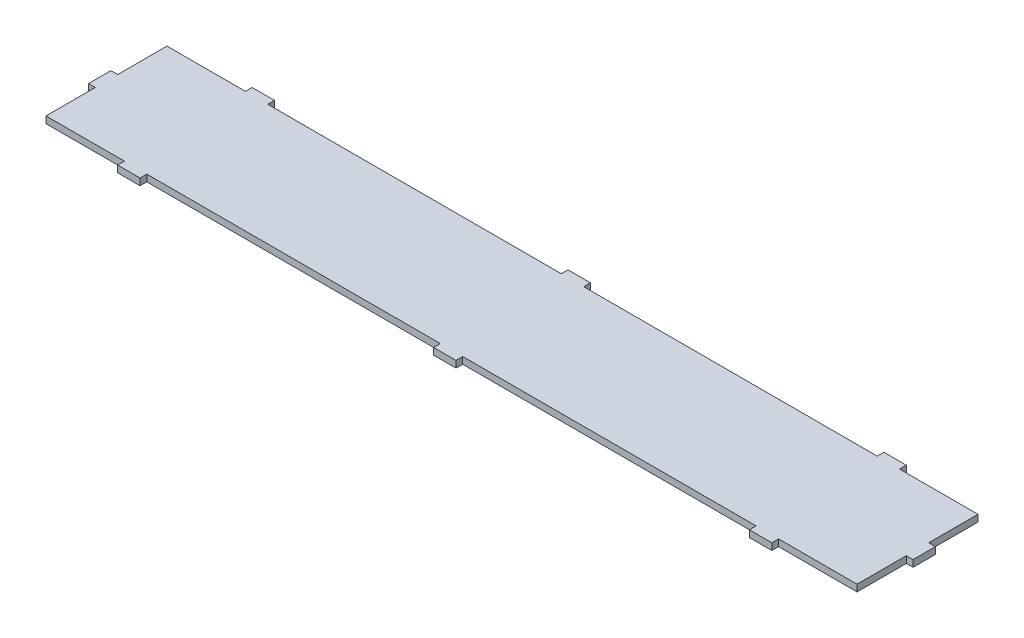
ISO-10303-21;
HEADER;
FILE_DESCRIPTION(('STEP AP214'),'2;1');
FILE_NAME('part.step','',(''),(''),'','','');
FILE_SCHEMA(('AUTOMOTIVE_DESIGN { 1 0 10303 214 1 1 1 1 }'));
ENDSEC;
DATA;
#1=APPLICATION_CONTEXT('core data for automotive mechanical design processes');
#2=APPLICATION_PROTOCOL_DEFINITION('international standard','automotive_design',2000,#1);
#3=PRODUCT_CONTEXT('',#1,'mechanical');
#4=PRODUCT('Part','Part','',(#3));
#5=PRODUCT_RELATED_PRODUCT_CATEGORY('part','',(#4));
#6=PRODUCT_DEFINITION_FORMATION('','',#4);
#7=PRODUCT_DEFINITION_CONTEXT('part definition',#1,'design');
#8=PRODUCT_DEFINITION('design','',#6,#7);
#9=PRODUCT_DEFINITION_SHAPE('','',#8);
#10=(LENGTH_UNIT() NAMED_UNIT(*) SI_UNIT(.MILLI.,.METRE.));
#11=(NAMED_UNIT(*) PLANE_ANGLE_UNIT() SI_UNIT($,.RADIAN.));
#12=(NAMED_UNIT(*) SI_UNIT($,.STERADIAN.) SOLID_ANGLE_UNIT());
#13=UNCERTAINTY_MEASURE_WITH_UNIT(LENGTH_MEASURE(1.E-05),#10,'distance_accuracy_value','');
#14=(GEOMETRIC_REPRESENTATION_CONTEXT(3) GLOBAL_UNCERTAINTY_ASSIGNED_CONTEXT((#13)) GLOBAL_UNIT_ASSIGNED_CONTEXT((#10,
#11,#12)) REPRESENTATION_CONTEXT('',''));
#15=CARTESIAN_POINT('',(0.,0.,0.));
#16=DIRECTION('',(0.,0.,1.));
#17=DIRECTION('',(1.,0.,0.));
#18=AXIS2_PLACEMENT_3D('',#15,#16,#17);
#19=CARTESIAN_POINT('',(181.,3.,0.));
#20=DIRECTION('',(1.,0.,0.));
#21=DIRECTION('',(0.,0.,-1.));
#22=AXIS2_PLACEMENT_3D('',#19,#20,#21);
#23=PLANE('',#22);
#24=DIRECTION('',(0.,0.,1.));
#25=VECTOR('',#24,1.);
#26=CARTESIAN_POINT('',(181.,0.,0.));
#27=LINE('',#26,#25);
#28=CARTESIAN_POINT('',(181.,0.,4.99999999999985));
#29=VERTEX_POINT('',#28);
#30=CARTESIAN_POINT('',(181.,0.,27.));
#31=VERTEX_POINT('',#30);
#32=EDGE_CURVE('E308',#29,#31,#27,.T.);
#33=ORIENTED_EDGE('',*,*,#32,.F.);
#34=DIRECTION('',(0.,-1.,0.));
#35=VECTOR('',#34,1.);
#36=CARTESIAN_POINT('',(181.,3.,4.99999999999985));
#37=LINE('',#36,#35);
#38=CARTESIAN_POINT('',(181.,3.,4.99999999999985));
#39=VERTEX_POINT('',#38);
#40=EDGE_CURVE('E11',#39,#29,#37,.T.);
#41=ORIENTED_EDGE('',*,*,#40,.F.);
#42=DIRECTION('',(0.,0.,1.));
#43=VECTOR('',#42,1.);
#44=CARTESIAN_POINT('',(181.,3.,0.));
#45=LINE('',#44,#43);
#46=CARTESIAN_POINT('',(181.,3.,27.));
#47=VERTEX_POINT('',#46);
#48=EDGE_CURVE('E438',#39,#47,#45,.T.);
#49=ORIENTED_EDGE('',*,*,#48,.T.);
#50=DIRECTION('',(0.,-1.,0.));
#51=VECTOR('',#50,1.);
#52=CARTESIAN_POINT('',(181.,3.,27.));
#53=LINE('',#52,#51);
#54=EDGE_CURVE('E176',#47,#31,#53,.T.);
#55=ORIENTED_EDGE('',*,*,#54,.T.);
#56=EDGE_LOOP('',(#33,#41,#49,#55));
#57=FACE_BOUND('',#56,.T.);
#58=ADVANCED_FACE('F41',(#57),#23,.T.);
#59=CARTESIAN_POINT('',(0.,3.,4.9999999999999));
#60=DIRECTION('',(0.,0.,1.));
#61=DIRECTION('',(1.,0.,0.));
#62=AXIS2_PLACEMENT_3D('',#59,#60,#61);
#63=PLANE('',#62);
#64=DIRECTION('',(-1.,0.,0.));
#65=VECTOR('',#64,1.);
#66=CARTESIAN_POINT('',(0.,0.,4.9999999999999));
#67=LINE('',#66,#65);
#68=CARTESIAN_POINT('',(184.,0.,4.99999999999985));
#69=VERTEX_POINT('',#68);
#70=EDGE_CURVE('E312',#69,#29,#67,.T.);
#71=ORIENTED_EDGE('',*,*,#70,.F.);
#72=DIRECTION('',(0.,-1.,0.));
#73=VECTOR('',#72,1.);
#74=CARTESIAN_POINT('',(184.,3.,4.99999999999985));
#75=LINE('',#74,#73);
#76=CARTESIAN_POINT('',(184.,3.,4.99999999999985));
#77=VERTEX_POINT('',#76);
#78=EDGE_CURVE('E50',#77,#69,#75,.T.);
#79=ORIENTED_EDGE('',*,*,#78,.F.);
#80=DIRECTION('',(-1.,0.,0.));
#81=VECTOR('',#80,1.);
#82=CARTESIAN_POINT('',(0.,3.,4.9999999999999));
#83=LINE('',#82,#81);
#84=EDGE_CURVE('E681',#77,#39,#83,.T.);
#85=ORIENTED_EDGE('',*,*,#84,.T.);
#86=ORIENTED_EDGE('',*,*,#40,.T.);
#87=EDGE_LOOP('',(#71,#79,#85,#86));
#88=FACE_BOUND('',#87,.T.);
#89=ADVANCED_FACE('F554',(#88),#63,.T.);
#90=CARTESIAN_POINT('',(184.,3.,0.));
#91=DIRECTION('',(1.,0.,0.));
#92=DIRECTION('',(0.,0.,-1.));
#93=AXIS2_PLACEMENT_3D('',#90,#91,#92);
#94=PLANE('',#93);
#95=DIRECTION('',(0.,0.,1.));
#96=VECTOR('',#95,1.);
#97=CARTESIAN_POINT('',(184.,0.,0.));
#98=LINE('',#97,#96);
#99=CARTESIAN_POINT('',(184.,0.,-5.00000000000015));
#100=VERTEX_POINT('',#99);
#101=EDGE_CURVE('E316',#100,#69,#98,.T.);
#102=ORIENTED_EDGE('',*,*,#101,.F.);
#103=DIRECTION('',(0.,-1.,0.));
#104=VECTOR('',#103,1.);
#105=CARTESIAN_POINT('',(184.,3.,-5.00000000000015));
#106=LINE('',#105,#104);
#107=CARTESIAN_POINT('',(184.,3.,-5.00000000000015));
#108=VERTEX_POINT('',#107);
#109=EDGE_CURVE('E541',#108,#100,#106,.T.);
#110=ORIENTED_EDGE('',*,*,#109,.F.);
#111=DIRECTION('',(0.,0.,1.));
#112=VECTOR('',#111,1.);
#113=CARTESIAN_POINT('',(184.,3.,0.));
#114=LINE('',#113,#112);
#115=EDGE_CURVE('E550',#108,#77,#114,.T.);
#116=ORIENTED_EDGE('',*,*,#115,.T.);
#117=ORIENTED_EDGE('',*,*,#78,.T.);
#118=EDGE_LOOP('',(#102,#110,#116,#117));
#119=FACE_BOUND('',#118,.T.);
#120=ADVANCED_FACE('F548',(#119),#94,.T.);
#121=CARTESIAN_POINT('',(0.,3.,-5.0000000000001));
#122=DIRECTION('',(0.,0.,1.));
#123=DIRECTION('',(1.,0.,0.));
#124=AXIS2_PLACEMENT_3D('',#121,#122,#123);
#125=PLANE('',#124);
#126=DIRECTION('',(-1.,0.,0.));
#127=VECTOR('',#126,1.);
#128=CARTESIAN_POINT('',(0.,0.,-5.0000000000001));
#129=LINE('',#128,#127);
#130=CARTESIAN_POINT('',(181.,0.,-5.00000000000015));
#131=VERTEX_POINT('',#130);
#132=EDGE_CURVE('E320',#100,#131,#129,.T.);
#133=ORIENTED_EDGE('',*,*,#132,.T.);
#134=DIRECTION('',(0.,-1.,0.));
#135=VECTOR('',#134,1.);
#136=CARTESIAN_POINT('',(181.,3.,-5.00000000000015));
#137=LINE('',#136,#135);
#138=CARTESIAN_POINT('',(181.,3.,-5.00000000000015));
#139=VERTEX_POINT('',#138);
#140=EDGE_CURVE('E537',#139,#131,#137,.T.);
#141=ORIENTED_EDGE('',*,*,#140,.F.);
#142=DIRECTION('',(-1.,0.,0.));
#143=VECTOR('',#142,1.);
#144=CARTESIAN_POINT('',(0.,3.,-5.0000000000001));
#145=LINE('',#144,#143);
#146=EDGE_CURVE('E572',#108,#139,#145,.T.);
#147=ORIENTED_EDGE('',*,*,#146,.F.);
#148=ORIENTED_EDGE('',*,*,#109,.T.);
#149=EDGE_LOOP('',(#133,#141,#147,#148));
#150=FACE_BOUND('',#149,.T.);
#151=ADVANCED_FACE('F561',(#150),#125,.F.);
#152=CARTESIAN_POINT('',(181.,3.,0.));
#153=DIRECTION('',(-1.,0.,0.));
#154=DIRECTION('',(0.,0.,1.));
#155=AXIS2_PLACEMENT_3D('',#152,#153,#154);
#156=PLANE('',#155);
#157=DIRECTION('',(0.,0.,-1.));
#158=VECTOR('',#157,1.);
#159=CARTESIAN_POINT('',(181.,0.,0.));
#160=LINE('',#159,#158);
#161=CARTESIAN_POINT('',(181.,0.,-27.));
#162=VERTEX_POINT('',#161);
#163=EDGE_CURVE('E323',#131,#162,#160,.T.);
#164=ORIENTED_EDGE('',*,*,#163,.T.);
#165=DIRECTION('',(0.,-1.,0.));
#166=VECTOR('',#165,1.);
#167=CARTESIAN_POINT('',(181.,3.,-27.));
#168=LINE('',#167,#166);
#169=CARTESIAN_POINT('',(181.,3.,-27.));
#170=VERTEX_POINT('',#169);
#171=EDGE_CURVE('E534',#170,#162,#168,.T.);
#172=ORIENTED_EDGE('',*,*,#171,.F.);
#173=DIRECTION('',(0.,0.,-1.));
#174=VECTOR('',#173,1.);
#175=CARTESIAN_POINT('',(181.,3.,0.));
#176=LINE('',#175,#174);
#177=EDGE_CURVE('E567',#139,#170,#176,.T.);
#178=ORIENTED_EDGE('',*,*,#177,.F.);
#179=ORIENTED_EDGE('',*,*,#140,.T.);
#180=EDGE_LOOP('',(#164,#172,#178,#179));
#181=FACE_BOUND('',#180,.T.);
#182=ADVANCED_FACE('F565',(#181),#156,.F.);
#183=CARTESIAN_POINT('',(0.,3.,-27.));
#184=DIRECTION('',(0.,0.,-1.));
#185=DIRECTION('',(-1.,0.,0.));
#186=AXIS2_PLACEMENT_3D('',#183,#184,#185);
#187=PLANE('',#186);
#188=DIRECTION('',(1.,0.,0.));
#189=VECTOR('',#188,1.);
#190=CARTESIAN_POINT('',(0.,0.,-27.));
#191=LINE('',#190,#189);
#192=CARTESIAN_POINT('',(146.,0.,-27.));
#193=VERTEX_POINT('',#192);
#194=EDGE_CURVE('E327',#193,#162,#191,.T.);
#195=ORIENTED_EDGE('',*,*,#194,.F.);
#196=DIRECTION('',(0.,-1.,0.));
#197=VECTOR('',#196,1.);
#198=CARTESIAN_POINT('',(146.,3.,-27.));
#199=LINE('',#198,#197);
#200=CARTESIAN_POINT('',(146.,3.,-27.));
#201=VERTEX_POINT('',#200);
#202=EDGE_CURVE('E531',#201,#193,#199,.T.);
#203=ORIENTED_EDGE('',*,*,#202,.F.);
#204=DIRECTION('',(1.,0.,0.));
#205=VECTOR('',#204,1.);
#206=CARTESIAN_POINT('',(0.,3.,-27.));
#207=LINE('',#206,#205);
#208=EDGE_CURVE('E571',#201,#170,#207,.T.);
#209=ORIENTED_EDGE('',*,*,#208,.T.);
#210=ORIENTED_EDGE('',*,*,#171,.T.);
#211=EDGE_LOOP('',(#195,#203,#209,#210));
#212=FACE_BOUND('',#211,.T.);
#213=ADVANCED_FACE('F699',(#212),#187,.T.);
#214=CARTESIAN_POINT('',(146.,3.,0.));
#215=DIRECTION('',(1.,0.,0.));
#216=DIRECTION('',(0.,0.,-1.));
#217=AXIS2_PLACEMENT_3D('',#214,#215,#216);
#218=PLANE('',#217);
#219=DIRECTION('',(0.,0.,1.));
#220=VECTOR('',#219,1.);
#221=CARTESIAN_POINT('',(146.,0.,0.));
#222=LINE('',#221,#220);
#223=CARTESIAN_POINT('',(146.,0.,-30.));
#224=VERTEX_POINT('',#223);
#225=EDGE_CURVE('E331',#224,#193,#222,.T.);
#226=ORIENTED_EDGE('',*,*,#225,.F.);
#227=DIRECTION('',(0.,-1.,0.));
#228=VECTOR('',#227,1.);
#229=CARTESIAN_POINT('',(146.,3.,-30.));
#230=LINE('',#229,#228);
#231=CARTESIAN_POINT('',(146.,3.,-30.));
#232=VERTEX_POINT('',#231);
#233=EDGE_CURVE('E528',#232,#224,#230,.T.);
#234=ORIENTED_EDGE('',*,*,#233,.F.);
#235=DIRECTION('',(0.,0.,1.));
#236=VECTOR('',#235,1.);
#237=CARTESIAN_POINT('',(146.,3.,0.));
#238=LINE('',#237,#236);
#239=EDGE_CURVE('E576',#232,#201,#238,.T.);
#240=ORIENTED_EDGE('',*,*,#239,.T.);
#241=ORIENTED_EDGE('',*,*,#202,.T.);
#242=EDGE_LOOP('',(#226,#234,#240,#241));
#243=FACE_BOUND('',#242,.T.);
#244=ADVANCED_FACE('F702',(#243),#218,.T.);
#245=CARTESIAN_POINT('',(0.,3.,-30.));
#246=DIRECTION('',(0.,0.,1.));
#247=DIRECTION('',(1.,0.,0.));
#248=AXIS2_PLACEMENT_3D('',#245,#246,#247);
#249=PLANE('',#248);
#250=DIRECTION('',(-1.,0.,0.));
#251=VECTOR('',#250,1.);
#252=CARTESIAN_POINT('',(0.,0.,-30.));
#253=LINE('',#252,#251);
#254=CARTESIAN_POINT('',(136.,0.,-30.));
#255=VERTEX_POINT('',#254);
#256=EDGE_CURVE('E335',#224,#255,#253,.T.);
#257=ORIENTED_EDGE('',*,*,#256,.T.);
#258=DIRECTION('',(0.,-1.,0.));
#259=VECTOR('',#258,1.);
#260=CARTESIAN_POINT('',(136.,3.,-30.));
#261=LINE('',#260,#259);
#262=CARTESIAN_POINT('',(136.,3.,-30.));
#263=VERTEX_POINT('',#262);
#264=EDGE_CURVE('E525',#263,#255,#261,.T.);
#265=ORIENTED_EDGE('',*,*,#264,.F.);
#266=DIRECTION('',(-1.,0.,0.));
#267=VECTOR('',#266,1.);
#268=CARTESIAN_POINT('',(0.,3.,-30.));
#269=LINE('',#268,#267);
#270=EDGE_CURVE('E584',#232,#263,#269,.T.);
#271=ORIENTED_EDGE('',*,*,#270,.F.);
#272=ORIENTED_EDGE('',*,*,#233,.T.);
#273=EDGE_LOOP('',(#257,#265,#271,#272));
#274=FACE_BOUND('',#273,.T.);
#275=ADVANCED_FACE('F706',(#274),#249,.F.);
#276=CARTESIAN_POINT('',(136.,3.,0.));
#277=DIRECTION('',(-1.,0.,0.));
#278=DIRECTION('',(0.,0.,1.));
#279=AXIS2_PLACEMENT_3D('',#276,#277,#278);
#280=PLANE('',#279);
#281=DIRECTION('',(0.,0.,-1.));
#282=VECTOR('',#281,1.);
#283=CARTESIAN_POINT('',(136.,0.,0.));
#284=LINE('',#283,#282);
#285=CARTESIAN_POINT('',(136.,0.,-27.));
#286=VERTEX_POINT('',#285);
#287=EDGE_CURVE('E339',#286,#255,#284,.T.);
#288=ORIENTED_EDGE('',*,*,#287,.F.);
#289=DIRECTION('',(0.,-1.,0.));
#290=VECTOR('',#289,1.);
#291=CARTESIAN_POINT('',(136.,3.,-27.));
#292=LINE('',#291,#290);
#293=CARTESIAN_POINT('',(136.,3.,-27.));
#294=VERTEX_POINT('',#293);
#295=EDGE_CURVE('E522',#294,#286,#292,.T.);
#296=ORIENTED_EDGE('',*,*,#295,.F.);
#297=DIRECTION('',(0.,0.,-1.));
#298=VECTOR('',#297,1.);
#299=CARTESIAN_POINT('',(136.,3.,0.));
#300=LINE('',#299,#298);
#301=EDGE_CURVE('E587',#294,#263,#300,.T.);
#302=ORIENTED_EDGE('',*,*,#301,.T.);
#303=ORIENTED_EDGE('',*,*,#264,.T.);
#304=EDGE_LOOP('',(#288,#296,#302,#303));
#305=FACE_BOUND('',#304,.T.);
#306=ADVANCED_FACE('F710',(#305),#280,.T.);
#307=CARTESIAN_POINT('',(0.,3.,-27.));
#308=DIRECTION('',(0.,0.,-1.));
#309=DIRECTION('',(-1.,0.,0.));
#310=AXIS2_PLACEMENT_3D('',#307,#308,#309);
#311=PLANE('',#310);
#312=DIRECTION('',(1.,0.,0.));
#313=VECTOR('',#312,1.);
#314=CARTESIAN_POINT('',(0.,0.,-27.));
#315=LINE('',#314,#313);
#316=CARTESIAN_POINT('',(5.,0.,-27.));
#317=VERTEX_POINT('',#316);
#318=EDGE_CURVE('E343',#317,#286,#315,.T.);
#319=ORIENTED_EDGE('',*,*,#318,.F.);
#320=DIRECTION('',(0.,-1.,0.));
#321=VECTOR('',#320,1.);
#322=CARTESIAN_POINT('',(5.,3.,-27.));
#323=LINE('',#322,#321);
#324=CARTESIAN_POINT('',(5.,3.,-27.));
#325=VERTEX_POINT('',#324);
#326=EDGE_CURVE('E519',#325,#317,#323,.T.);
#327=ORIENTED_EDGE('',*,*,#326,.F.);
#328=DIRECTION('',(1.,0.,0.));
#329=VECTOR('',#328,1.);
#330=CARTESIAN_POINT('',(0.,3.,-27.));
#331=LINE('',#330,#329);
#332=EDGE_CURVE('E591',#325,#294,#331,.T.);
#333=ORIENTED_EDGE('',*,*,#332,.T.);
#334=ORIENTED_EDGE('',*,*,#295,.T.);
#335=EDGE_LOOP('',(#319,#327,#333,#334));
#336=FACE_BOUND('',#335,.T.);
#337=ADVANCED_FACE('F714',(#336),#311,.T.);
#338=CARTESIAN_POINT('',(5.00000000000001,3.,0.));
#339=DIRECTION('',(-1.,0.,0.));
#340=DIRECTION('',(0.,0.,1.));
#341=AXIS2_PLACEMENT_3D('',#338,#339,#340);
#342=PLANE('',#341);
#343=DIRECTION('',(0.,0.,-1.));
#344=VECTOR('',#343,1.);
#345=CARTESIAN_POINT('',(5.00000000000001,0.,0.));
#346=LINE('',#345,#344);
#347=CARTESIAN_POINT('',(5.,0.,-30.));
#348=VERTEX_POINT('',#347);
#349=EDGE_CURVE('E347',#317,#348,#346,.T.);
#350=ORIENTED_EDGE('',*,*,#349,.T.);
#351=DIRECTION('',(0.,-1.,0.));
#352=VECTOR('',#351,1.);
#353=CARTESIAN_POINT('',(5.,3.,-30.));
#354=LINE('',#353,#352);
#355=CARTESIAN_POINT('',(5.,3.,-30.));
#356=VERTEX_POINT('',#355);
#357=EDGE_CURVE('E515',#356,#348,#354,.T.);
#358=ORIENTED_EDGE('',*,*,#357,.F.);
#359=DIRECTION('',(0.,0.,-1.));
#360=VECTOR('',#359,1.);
#361=CARTESIAN_POINT('',(5.00000000000001,3.,0.));
#362=LINE('',#361,#360);
#363=EDGE_CURVE('E595',#325,#356,#362,.T.);
#364=ORIENTED_EDGE('',*,*,#363,.F.);
#365=ORIENTED_EDGE('',*,*,#326,.T.);
#366=EDGE_LOOP('',(#350,#358,#364,#365));
#367=FACE_BOUND('',#366,.T.);
#368=ADVANCED_FACE('F718',(#367),#342,.F.);
#369=CARTESIAN_POINT('',(0.,3.,-30.));
#370=DIRECTION('',(0.,0.,1.));
#371=DIRECTION('',(1.,0.,0.));
#372=AXIS2_PLACEMENT_3D('',#369,#370,#371);
#373=PLANE('',#372);
#374=DIRECTION('',(-1.,0.,0.));
#375=VECTOR('',#374,1.);
#376=CARTESIAN_POINT('',(0.,0.,-30.));
#377=LINE('',#376,#375);
#378=CARTESIAN_POINT('',(-5.,0.,-30.));
#379=VERTEX_POINT('',#378);
#380=EDGE_CURVE('E350',#348,#379,#377,.T.);
#381=ORIENTED_EDGE('',*,*,#380,.T.);
#382=DIRECTION('',(0.,-1.,0.));
#383=VECTOR('',#382,1.);
#384=CARTESIAN_POINT('',(-5.,3.,-30.));
#385=LINE('',#384,#383);
#386=CARTESIAN_POINT('',(-5.,3.,-30.));
#387=VERTEX_POINT('',#386);
#388=EDGE_CURVE('E512',#387,#379,#385,.T.);
#389=ORIENTED_EDGE('',*,*,#388,.F.);
#390=DIRECTION('',(-1.,0.,0.));
#391=VECTOR('',#390,1.);
#392=CARTESIAN_POINT('',(0.,3.,-30.));
#393=LINE('',#392,#391);
#394=EDGE_CURVE('E598',#356,#387,#393,.T.);
#395=ORIENTED_EDGE('',*,*,#394,.F.);
#396=ORIENTED_EDGE('',*,*,#357,.T.);
#397=EDGE_LOOP('',(#381,#389,#395,#396));
#398=FACE_BOUND('',#397,.T.);
#399=ADVANCED_FACE('F722',(#398),#373,.F.);
#400=CARTESIAN_POINT('',(-5.00000000000001,3.,0.));
#401=DIRECTION('',(-1.,0.,0.));
#402=DIRECTION('',(0.,0.,1.));
#403=AXIS2_PLACEMENT_3D('',#400,#401,#402);
#404=PLANE('',#403);
#405=DIRECTION('',(0.,0.,-1.));
#406=VECTOR('',#405,1.);
#407=CARTESIAN_POINT('',(-5.00000000000001,0.,0.));
#408=LINE('',#407,#406);
#409=CARTESIAN_POINT('',(-5.,0.,-27.));
#410=VERTEX_POINT('',#409);
#411=EDGE_CURVE('E354',#410,#379,#408,.T.);
#412=ORIENTED_EDGE('',*,*,#411,.F.);
#413=DIRECTION('',(0.,-1.,0.));
#414=VECTOR('',#413,1.);
#415=CARTESIAN_POINT('',(-5.,3.,-27.));
#416=LINE('',#415,#414);
#417=CARTESIAN_POINT('',(-5.,3.,-27.));
#418=VERTEX_POINT('',#417);
#419=EDGE_CURVE('E509',#418,#410,#416,.T.);
#420=ORIENTED_EDGE('',*,*,#419,.F.);
#421=DIRECTION('',(0.,0.,-1.));
#422=VECTOR('',#421,1.);
#423=CARTESIAN_POINT('',(-5.00000000000001,3.,0.));
#424=LINE('',#423,#422);
#425=EDGE_CURVE('E601',#418,#387,#424,.T.);
#426=ORIENTED_EDGE('',*,*,#425,.T.);
#427=ORIENTED_EDGE('',*,*,#388,.T.);
#428=EDGE_LOOP('',(#412,#420,#426,#427));
#429=FACE_BOUND('',#428,.T.);
#430=ADVANCED_FACE('F726',(#429),#404,.T.);
#431=CARTESIAN_POINT('',(0.,3.,-27.));
#432=DIRECTION('',(0.,0.,-1.));
#433=DIRECTION('',(-1.,0.,0.));
#434=AXIS2_PLACEMENT_3D('',#431,#432,#433);
#435=PLANE('',#434);
#436=DIRECTION('',(1.,0.,0.));
#437=VECTOR('',#436,1.);
#438=CARTESIAN_POINT('',(0.,0.,-27.));
#439=LINE('',#438,#437);
#440=CARTESIAN_POINT('',(-136.,0.,-27.));
#441=VERTEX_POINT('',#440);
#442=EDGE_CURVE('E358',#441,#410,#439,.T.);
#443=ORIENTED_EDGE('',*,*,#442,.F.);
#444=DIRECTION('',(0.,-1.,0.));
#445=VECTOR('',#444,1.);
#446=CARTESIAN_POINT('',(-136.,3.,-27.));
#447=LINE('',#446,#445);
#448=CARTESIAN_POINT('',(-136.,3.,-27.));
#449=VERTEX_POINT('',#448);
#450=EDGE_CURVE('E506',#449,#441,#447,.T.);
#451=ORIENTED_EDGE('',*,*,#450,.F.);
#452=DIRECTION('',(1.,0.,0.));
#453=VECTOR('',#452,1.);
#454=CARTESIAN_POINT('',(0.,3.,-27.));
#455=LINE('',#454,#453);
#456=EDGE_CURVE('E605',#449,#418,#455,.T.);
#457=ORIENTED_EDGE('',*,*,#456,.T.);
#458=ORIENTED_EDGE('',*,*,#419,.T.);
#459=EDGE_LOOP('',(#443,#451,#457,#458));
#460=FACE_BOUND('',#459,.T.);
#461=ADVANCED_FACE('F730',(#460),#435,.T.);
#462=CARTESIAN_POINT('',(-136.,3.,0.));
#463=DIRECTION('',(-1.,0.,0.));
#464=DIRECTION('',(0.,0.,1.));
#465=AXIS2_PLACEMENT_3D('',#462,#463,#464);
#466=PLANE('',#465);
#467=DIRECTION('',(0.,0.,-1.));
#468=VECTOR('',#467,1.);
#469=CARTESIAN_POINT('',(-136.,0.,0.));
#470=LINE('',#469,#468);
#471=CARTESIAN_POINT('',(-136.,0.,-30.));
#472=VERTEX_POINT('',#471);
#473=EDGE_CURVE('E362',#441,#472,#470,.T.);
#474=ORIENTED_EDGE('',*,*,#473,.T.);
#475=DIRECTION('',(0.,-1.,0.));
#476=VECTOR('',#475,1.);
#477=CARTESIAN_POINT('',(-136.,3.,-30.));
#478=LINE('',#477,#476);
#479=CARTESIAN_POINT('',(-136.,3.,-30.));
#480=VERTEX_POINT('',#479);
#481=EDGE_CURVE('E502',#480,#472,#478,.T.);
#482=ORIENTED_EDGE('',*,*,#481,.F.);
#483=DIRECTION('',(0.,0.,-1.));
#484=VECTOR('',#483,1.);
#485=CARTESIAN_POINT('',(-136.,3.,0.));
#486=LINE('',#485,#484);
#487=EDGE_CURVE('E609',#449,#480,#486,.T.);
#488=ORIENTED_EDGE('',*,*,#487,.F.);
#489=ORIENTED_EDGE('',*,*,#450,.T.);
#490=EDGE_LOOP('',(#474,#482,#488,#489));
#491=FACE_BOUND('',#490,.T.);
#492=ADVANCED_FACE('F734',(#491),#466,.F.);
#493=CARTESIAN_POINT('',(0.,3.,-30.));
#494=DIRECTION('',(0.,0.,1.));
#495=DIRECTION('',(1.,0.,0.));
#496=AXIS2_PLACEMENT_3D('',#493,#494,#495);
#497=PLANE('',#496);
#498=DIRECTION('',(-1.,0.,0.));
#499=VECTOR('',#498,1.);
#500=CARTESIAN_POINT('',(0.,0.,-30.));
#501=LINE('',#500,#499);
#502=CARTESIAN_POINT('',(-146.,0.,-30.));
#503=VERTEX_POINT('',#502);
#504=EDGE_CURVE('E365',#472,#503,#501,.T.);
#505=ORIENTED_EDGE('',*,*,#504,.T.);
#506=DIRECTION('',(0.,-1.,0.));
#507=VECTOR('',#506,1.);
#508=CARTESIAN_POINT('',(-146.,3.,-30.));
#509=LINE('',#508,#507);
#510=CARTESIAN_POINT('',(-146.,3.,-30.));
#511=VERTEX_POINT('',#510);
#512=EDGE_CURVE('E498',#511,#503,#509,.T.);
#513=ORIENTED_EDGE('',*,*,#512,.F.);
#514=DIRECTION('',(-1.,0.,0.));
#515=VECTOR('',#514,1.);
#516=CARTESIAN_POINT('',(0.,3.,-30.));
#517=LINE('',#516,#515);
#518=EDGE_CURVE('E612',#480,#511,#517,.T.);
#519=ORIENTED_EDGE('',*,*,#518,.F.);
#520=ORIENTED_EDGE('',*,*,#481,.T.);
#521=EDGE_LOOP('',(#505,#513,#519,#520));
#522=FACE_BOUND('',#521,.T.);
#523=ADVANCED_FACE('F738',(#522),#497,.F.);
#524=CARTESIAN_POINT('',(-146.,3.,0.));
#525=DIRECTION('',(1.,0.,0.));
#526=DIRECTION('',(0.,0.,-1.));
#527=AXIS2_PLACEMENT_3D('',#524,#525,#526);
#528=PLANE('',#527);
#529=DIRECTION('',(0.,0.,1.));
#530=VECTOR('',#529,1.);
#531=CARTESIAN_POINT('',(-146.,0.,0.));
#532=LINE('',#531,#530);
#533=CARTESIAN_POINT('',(-146.,0.,-27.));
#534=VERTEX_POINT('',#533);
#535=EDGE_CURVE('E368',#503,#534,#532,.T.);
#536=ORIENTED_EDGE('',*,*,#535,.T.);
#537=DIRECTION('',(0.,-1.,0.));
#538=VECTOR('',#537,1.);
#539=CARTESIAN_POINT('',(-146.,3.,-27.));
#540=LINE('',#539,#538);
#541=CARTESIAN_POINT('',(-146.,3.,-27.));
#542=VERTEX_POINT('',#541);
#543=EDGE_CURVE('E495',#542,#534,#540,.T.);
#544=ORIENTED_EDGE('',*,*,#543,.F.);
#545=DIRECTION('',(0.,0.,1.));
#546=VECTOR('',#545,1.);
#547=CARTESIAN_POINT('',(-146.,3.,0.));
#548=LINE('',#547,#546);
#549=EDGE_CURVE('E615',#511,#542,#548,.T.);
#550=ORIENTED_EDGE('',*,*,#549,.F.);
#551=ORIENTED_EDGE('',*,*,#512,.T.);
#552=EDGE_LOOP('',(#536,#544,#550,#551));
#553=FACE_BOUND('',#552,.T.);
#554=ADVANCED_FACE('F742',(#553),#528,.F.);
#555=CARTESIAN_POINT('',(0.,3.,-27.));
#556=DIRECTION('',(0.,0.,-1.));
#557=DIRECTION('',(-1.,0.,0.));
#558=AXIS2_PLACEMENT_3D('',#555,#556,#557);
#559=PLANE('',#558);
#560=DIRECTION('',(1.,0.,0.));
#561=VECTOR('',#560,1.);
#562=CARTESIAN_POINT('',(0.,0.,-27.));
#563=LINE('',#562,#561);
#564=CARTESIAN_POINT('',(-181.,0.,-27.));
#565=VERTEX_POINT('',#564);
#566=EDGE_CURVE('E372',#565,#534,#563,.T.);
#567=ORIENTED_EDGE('',*,*,#566,.F.);
#568=DIRECTION('',(0.,-1.,0.));
#569=VECTOR('',#568,1.);
#570=CARTESIAN_POINT('',(-181.,3.,-27.));
#571=LINE('',#570,#569);
#572=CARTESIAN_POINT('',(-181.,3.,-27.));
#573=VERTEX_POINT('',#572);
#574=EDGE_CURVE('E492',#573,#565,#571,.T.);
#575=ORIENTED_EDGE('',*,*,#574,.F.);
#576=DIRECTION('',(1.,0.,0.));
#577=VECTOR('',#576,1.);
#578=CARTESIAN_POINT('',(0.,3.,-27.));
#579=LINE('',#578,#577);
#580=EDGE_CURVE('E618',#573,#542,#579,.T.);
#581=ORIENTED_EDGE('',*,*,#580,.T.);
#582=ORIENTED_EDGE('',*,*,#543,.T.);
#583=EDGE_LOOP('',(#567,#575,#581,#582));
#584=FACE_BOUND('',#583,.T.);
#585=ADVANCED_FACE('F746',(#584),#559,.T.);
#586=CARTESIAN_POINT('',(-181.,3.,0.));
#587=DIRECTION('',(1.,0.,0.));
#588=DIRECTION('',(0.,0.,-1.));
#589=AXIS2_PLACEMENT_3D('',#586,#587,#588);
#590=PLANE('',#589);
#591=DIRECTION('',(0.,0.,1.));
#592=VECTOR('',#591,1.);
#593=CARTESIAN_POINT('',(-181.,0.,0.));
#594=LINE('',#593,#592);
#595=CARTESIAN_POINT('',(-181.,0.,-5.00000000000002));
#596=VERTEX_POINT('',#595);
#597=EDGE_CURVE('E376',#565,#596,#594,.T.);
#598=ORIENTED_EDGE('',*,*,#597,.T.);
#599=DIRECTION('',(0.,-1.,0.));
#600=VECTOR('',#599,1.);
#601=CARTESIAN_POINT('',(-181.,3.,-5.00000000000002));
#602=LINE('',#601,#600);
#603=CARTESIAN_POINT('',(-181.,3.,-5.00000000000002));
#604=VERTEX_POINT('',#603);
#605=EDGE_CURVE('E488',#604,#596,#602,.T.);
#606=ORIENTED_EDGE('',*,*,#605,.F.);
#607=DIRECTION('',(0.,0.,1.));
#608=VECTOR('',#607,1.);
#609=CARTESIAN_POINT('',(-181.,3.,0.));
#610=LINE('',#609,#608);
#611=EDGE_CURVE('E622',#573,#604,#610,.T.);
#612=ORIENTED_EDGE('',*,*,#611,.F.);
#613=ORIENTED_EDGE('',*,*,#574,.T.);
#614=EDGE_LOOP('',(#598,#606,#612,#613));
#615=FACE_BOUND('',#614,.T.);
#616=ADVANCED_FACE('F750',(#615),#590,.F.);
#617=CARTESIAN_POINT('',(0.,3.,-5.00000000000002));
#618=DIRECTION('',(0.,0.,1.));
#619=DIRECTION('',(1.,0.,0.));
#620=AXIS2_PLACEMENT_3D('',#617,#618,#619);
#621=PLANE('',#620);
#622=DIRECTION('',(-1.,0.,0.));
#623=VECTOR('',#622,1.);
#624=CARTESIAN_POINT('',(0.,0.,-5.00000000000002));
#625=LINE('',#624,#623);
#626=CARTESIAN_POINT('',(-184.,0.,-5.00000000000002));
#627=VERTEX_POINT('',#626);
#628=EDGE_CURVE('E379',#596,#627,#625,.T.);
#629=ORIENTED_EDGE('',*,*,#628,.T.);
#630=DIRECTION('',(0.,-1.,0.));
#631=VECTOR('',#630,1.);
#632=CARTESIAN_POINT('',(-184.,3.,-5.00000000000002));
#633=LINE('',#632,#631);
#634=CARTESIAN_POINT('',(-184.,3.,-5.00000000000002));
#635=VERTEX_POINT('',#634);
#636=EDGE_CURVE('E484',#635,#627,#633,.T.);
#637=ORIENTED_EDGE('',*,*,#636,.F.);
#638=DIRECTION('',(-1.,0.,0.));
#639=VECTOR('',#638,1.);
#640=CARTESIAN_POINT('',(0.,3.,-5.00000000000002));
#641=LINE('',#640,#639);
#642=EDGE_CURVE('E625',#604,#635,#641,.T.);
#643=ORIENTED_EDGE('',*,*,#642,.F.);
#644=ORIENTED_EDGE('',*,*,#605,.T.);
#645=EDGE_LOOP('',(#629,#637,#643,#644));
#646=FACE_BOUND('',#645,.T.);
#647=ADVANCED_FACE('F754',(#646),#621,.F.);
#648=CARTESIAN_POINT('',(-184.,3.,0.));
#649=DIRECTION('',(1.,0.,0.));
#650=DIRECTION('',(0.,0.,-1.));
#651=AXIS2_PLACEMENT_3D('',#648,#649,#650);
#652=PLANE('',#651);
#653=DIRECTION('',(0.,0.,1.));
#654=VECTOR('',#653,1.);
#655=CARTESIAN_POINT('',(-184.,0.,0.));
#656=LINE('',#655,#654);
#657=CARTESIAN_POINT('',(-184.,0.,4.99999999999998));
#658=VERTEX_POINT('',#657);
#659=EDGE_CURVE('E382',#627,#658,#656,.T.);
#660=ORIENTED_EDGE('',*,*,#659,.T.);
#661=DIRECTION('',(0.,-1.,0.));
#662=VECTOR('',#661,1.);
#663=CARTESIAN_POINT('',(-184.,3.,4.99999999999998));
#664=LINE('',#663,#662);
#665=CARTESIAN_POINT('',(-184.,3.,4.99999999999998));
#666=VERTEX_POINT('',#665);
#667=EDGE_CURVE('E481',#666,#658,#664,.T.);
#668=ORIENTED_EDGE('',*,*,#667,.F.);
#669=DIRECTION('',(0.,0.,1.));
#670=VECTOR('',#669,1.);
#671=CARTESIAN_POINT('',(-184.,3.,0.));
#672=LINE('',#671,#670);
#673=EDGE_CURVE('E628',#635,#666,#672,.T.);
#674=ORIENTED_EDGE('',*,*,#673,.F.);
#675=ORIENTED_EDGE('',*,*,#636,.T.);
#676=EDGE_LOOP('',(#660,#668,#674,#675));
#677=FACE_BOUND('',#676,.T.);
#678=ADVANCED_FACE('F758',(#677),#652,.F.);
#679=CARTESIAN_POINT('',(0.,3.,4.99999999999998));
#680=DIRECTION('',(0.,0.,1.));
#681=DIRECTION('',(1.,0.,0.));
#682=AXIS2_PLACEMENT_3D('',#679,#680,#681);
#683=PLANE('',#682);
#684=DIRECTION('',(-1.,0.,0.));
#685=VECTOR('',#684,1.);
#686=CARTESIAN_POINT('',(0.,0.,4.99999999999998));
#687=LINE('',#686,#685);
#688=CARTESIAN_POINT('',(-181.,0.,4.99999999999998));
#689=VERTEX_POINT('',#688);
#690=EDGE_CURVE('E386',#689,#658,#687,.T.);
#691=ORIENTED_EDGE('',*,*,#690,.F.);
#692=DIRECTION('',(0.,-1.,0.));
#693=VECTOR('',#692,1.);
#694=CARTESIAN_POINT('',(-181.,3.,4.99999999999998));
#695=LINE('',#694,#693);
#696=CARTESIAN_POINT('',(-181.,3.,4.99999999999998));
#697=VERTEX_POINT('',#696);
#698=EDGE_CURVE('E478',#697,#689,#695,.T.);
#699=ORIENTED_EDGE('',*,*,#698,.F.);
#700=DIRECTION('',(-1.,0.,0.));
#701=VECTOR('',#700,1.);
#702=CARTESIAN_POINT('',(0.,3.,4.99999999999998));
#703=LINE('',#702,#701);
#704=EDGE_CURVE('E631',#697,#666,#703,.T.);
#705=ORIENTED_EDGE('',*,*,#704,.T.);
#706=ORIENTED_EDGE('',*,*,#667,.T.);
#707=EDGE_LOOP('',(#691,#699,#705,#706));
#708=FACE_BOUND('',#707,.T.);
#709=ADVANCED_FACE('F762',(#708),#683,.T.);
#710=CARTESIAN_POINT('',(-181.,3.,0.));
#711=DIRECTION('',(1.,0.,0.));
#712=DIRECTION('',(0.,0.,-1.));
#713=AXIS2_PLACEMENT_3D('',#710,#711,#712);
#714=PLANE('',#713);
#715=DIRECTION('',(0.,0.,1.));
#716=VECTOR('',#715,1.);
#717=CARTESIAN_POINT('',(-181.,0.,0.));
#718=LINE('',#717,#716);
#719=CARTESIAN_POINT('',(-181.,0.,27.));
#720=VERTEX_POINT('',#719);
#721=EDGE_CURVE('E390',#689,#720,#718,.T.);
#722=ORIENTED_EDGE('',*,*,#721,.T.);
#723=DIRECTION('',(0.,-1.,0.));
#724=VECTOR('',#723,1.);
#725=CARTESIAN_POINT('',(-181.,3.,27.));
#726=LINE('',#725,#724);
#727=CARTESIAN_POINT('',(-181.,3.,27.));
#728=VERTEX_POINT('',#727);
#729=EDGE_CURVE('E474',#728,#720,#726,.T.);
#730=ORIENTED_EDGE('',*,*,#729,.F.);
#731=DIRECTION('',(0.,0.,1.));
#732=VECTOR('',#731,1.);
#733=CARTESIAN_POINT('',(-181.,3.,0.));
#734=LINE('',#733,#732);
#735=EDGE_CURVE('E635',#697,#728,#734,.T.);
#736=ORIENTED_EDGE('',*,*,#735,.F.);
#737=ORIENTED_EDGE('',*,*,#698,.T.);
#738=EDGE_LOOP('',(#722,#730,#736,#737));
#739=FACE_BOUND('',#738,.T.);
#740=ADVANCED_FACE('F766',(#739),#714,.F.);
#741=CARTESIAN_POINT('',(0.,3.,27.));
#742=DIRECTION('',(0.,0.,-1.));
#743=DIRECTION('',(-1.,0.,0.));
#744=AXIS2_PLACEMENT_3D('',#741,#742,#743);
#745=PLANE('',#744);
#746=DIRECTION('',(1.,0.,0.));
#747=VECTOR('',#746,1.);
#748=CARTESIAN_POINT('',(0.,0.,27.));
#749=LINE('',#748,#747);
#750=CARTESIAN_POINT('',(-146.,0.,27.));
#751=VERTEX_POINT('',#750);
#752=EDGE_CURVE('E393',#720,#751,#749,.T.);
#753=ORIENTED_EDGE('',*,*,#752,.T.);
#754=DIRECTION('',(0.,-1.,0.));
#755=VECTOR('',#754,1.);
#756=CARTESIAN_POINT('',(-146.,3.,27.));
#757=LINE('',#756,#755);
#758=CARTESIAN_POINT('',(-146.,3.,27.));
#759=VERTEX_POINT('',#758);
#760=EDGE_CURVE('E471',#759,#751,#757,.T.);
#761=ORIENTED_EDGE('',*,*,#760,.F.);
#762=DIRECTION('',(1.,0.,0.));
#763=VECTOR('',#762,1.);
#764=CARTESIAN_POINT('',(0.,3.,27.));
#765=LINE('',#764,#763);
#766=EDGE_CURVE('E638',#728,#759,#765,.T.);
#767=ORIENTED_EDGE('',*,*,#766,.F.);
#768=ORIENTED_EDGE('',*,*,#729,.T.);
#769=EDGE_LOOP('',(#753,#761,#767,#768));
#770=FACE_BOUND('',#769,.T.);
#771=ADVANCED_FACE('F770',(#770),#745,.F.);
#772=CARTESIAN_POINT('',(-146.,3.,0.));
#773=DIRECTION('',(-1.,0.,0.));
#774=DIRECTION('',(0.,0.,1.));
#775=AXIS2_PLACEMENT_3D('',#772,#773,#774);
#776=PLANE('',#775);
#777=DIRECTION('',(0.,0.,-1.));
#778=VECTOR('',#777,1.);
#779=CARTESIAN_POINT('',(-146.,0.,0.));
#780=LINE('',#779,#778);
#781=CARTESIAN_POINT('',(-146.,0.,30.));
#782=VERTEX_POINT('',#781);
#783=EDGE_CURVE('E397',#782,#751,#780,.T.);
#784=ORIENTED_EDGE('',*,*,#783,.F.);
#785=DIRECTION('',(0.,-1.,0.));
#786=VECTOR('',#785,1.);
#787=CARTESIAN_POINT('',(-146.,3.,30.));
#788=LINE('',#787,#786);
#789=CARTESIAN_POINT('',(-146.,3.,30.));
#790=VERTEX_POINT('',#789);
#791=EDGE_CURVE('E468',#790,#782,#788,.T.);
#792=ORIENTED_EDGE('',*,*,#791,.F.);
#793=DIRECTION('',(0.,0.,-1.));
#794=VECTOR('',#793,1.);
#795=CARTESIAN_POINT('',(-146.,3.,0.));
#796=LINE('',#795,#794);
#797=EDGE_CURVE('E641',#790,#759,#796,.T.);
#798=ORIENTED_EDGE('',*,*,#797,.T.);
#799=ORIENTED_EDGE('',*,*,#760,.T.);
#800=EDGE_LOOP('',(#784,#792,#798,#799));
#801=FACE_BOUND('',#800,.T.);
#802=ADVANCED_FACE('F774',(#801),#776,.T.);
#803=CARTESIAN_POINT('',(0.,3.,30.));
#804=DIRECTION('',(0.,0.,1.));
#805=DIRECTION('',(1.,0.,0.));
#806=AXIS2_PLACEMENT_3D('',#803,#804,#805);
#807=PLANE('',#806);
#808=DIRECTION('',(-1.,0.,0.));
#809=VECTOR('',#808,1.);
#810=CARTESIAN_POINT('',(0.,0.,30.));
#811=LINE('',#810,#809);
#812=CARTESIAN_POINT('',(-136.,0.,30.));
#813=VERTEX_POINT('',#812);
#814=EDGE_CURVE('E401',#813,#782,#811,.T.);
#815=ORIENTED_EDGE('',*,*,#814,.F.);
#816=DIRECTION('',(0.,-1.,0.));
#817=VECTOR('',#816,1.);
#818=CARTESIAN_POINT('',(-136.,3.,30.));
#819=LINE('',#818,#817);
#820=CARTESIAN_POINT('',(-136.,3.,30.));
#821=VERTEX_POINT('',#820);
#822=EDGE_CURVE('E465',#821,#813,#819,.T.);
#823=ORIENTED_EDGE('',*,*,#822,.F.);
#824=DIRECTION('',(-1.,0.,0.));
#825=VECTOR('',#824,1.);
#826=CARTESIAN_POINT('',(0.,3.,30.));
#827=LINE('',#826,#825);
#828=EDGE_CURVE('E645',#821,#790,#827,.T.);
#829=ORIENTED_EDGE('',*,*,#828,.T.);
#830=ORIENTED_EDGE('',*,*,#791,.T.);
#831=EDGE_LOOP('',(#815,#823,#829,#830));
#832=FACE_BOUND('',#831,.T.);
#833=ADVANCED_FACE('F778',(#832),#807,.T.);
#834=CARTESIAN_POINT('',(-136.,3.,0.));
#835=DIRECTION('',(1.,0.,0.));
#836=DIRECTION('',(0.,0.,-1.));
#837=AXIS2_PLACEMENT_3D('',#834,#835,#836);
#838=PLANE('',#837);
#839=DIRECTION('',(0.,0.,1.));
#840=VECTOR('',#839,1.);
#841=CARTESIAN_POINT('',(-136.,0.,0.));
#842=LINE('',#841,#840);
#843=CARTESIAN_POINT('',(-136.,0.,27.));
#844=VERTEX_POINT('',#843);
#845=EDGE_CURVE('E405',#844,#813,#842,.T.);
#846=ORIENTED_EDGE('',*,*,#845,.F.);
#847=DIRECTION('',(0.,-1.,0.));
#848=VECTOR('',#847,1.);
#849=CARTESIAN_POINT('',(-136.,3.,27.));
#850=LINE('',#849,#848);
#851=CARTESIAN_POINT('',(-136.,3.,27.));
#852=VERTEX_POINT('',#851);
#853=EDGE_CURVE('E462',#852,#844,#850,.T.);
#854=ORIENTED_EDGE('',*,*,#853,.F.);
#855=DIRECTION('',(0.,0.,1.));
#856=VECTOR('',#855,1.);
#857=CARTESIAN_POINT('',(-136.,3.,0.));
#858=LINE('',#857,#856);
#859=EDGE_CURVE('E649',#852,#821,#858,.T.);
#860=ORIENTED_EDGE('',*,*,#859,.T.);
#861=ORIENTED_EDGE('',*,*,#822,.T.);
#862=EDGE_LOOP('',(#846,#854,#860,#861));
#863=FACE_BOUND('',#862,.T.);
#864=ADVANCED_FACE('F782',(#863),#838,.T.);
#865=CARTESIAN_POINT('',(0.,3.,27.));
#866=DIRECTION('',(0.,0.,-1.));
#867=DIRECTION('',(-1.,0.,0.));
#868=AXIS2_PLACEMENT_3D('',#865,#866,#867);
#869=PLANE('',#868);
#870=DIRECTION('',(1.,0.,0.));
#871=VECTOR('',#870,1.);
#872=CARTESIAN_POINT('',(0.,0.,27.));
#873=LINE('',#872,#871);
#874=CARTESIAN_POINT('',(-5.,0.,27.));
#875=VERTEX_POINT('',#874);
#876=EDGE_CURVE('E409',#844,#875,#873,.T.);
#877=ORIENTED_EDGE('',*,*,#876,.T.);
#878=DIRECTION('',(0.,-1.,0.));
#879=VECTOR('',#878,1.);
#880=CARTESIAN_POINT('',(-5.,3.,27.));
#881=LINE('',#880,#879);
#882=CARTESIAN_POINT('',(-5.,3.,27.));
#883=VERTEX_POINT('',#882);
#884=EDGE_CURVE('E458',#883,#875,#881,.T.);
#885=ORIENTED_EDGE('',*,*,#884,.F.);
#886=DIRECTION('',(1.,0.,0.));
#887=VECTOR('',#886,1.);
#888=CARTESIAN_POINT('',(0.,3.,27.));
#889=LINE('',#888,#887);
#890=EDGE_CURVE('E653',#852,#883,#889,.T.);
#891=ORIENTED_EDGE('',*,*,#890,.F.);
#892=ORIENTED_EDGE('',*,*,#853,.T.);
#893=EDGE_LOOP('',(#877,#885,#891,#892));
#894=FACE_BOUND('',#893,.T.);
#895=ADVANCED_FACE('F786',(#894),#869,.F.);
#896=CARTESIAN_POINT('',(-5.,3.,0.));
#897=DIRECTION('',(1.,0.,0.));
#898=DIRECTION('',(0.,0.,-1.));
#899=AXIS2_PLACEMENT_3D('',#896,#897,#898);
#900=PLANE('',#899);
#901=DIRECTION('',(0.,0.,1.));
#902=VECTOR('',#901,1.);
#903=CARTESIAN_POINT('',(-5.,0.,0.));
#904=LINE('',#903,#902);
#905=CARTESIAN_POINT('',(-5.,0.,30.));
#906=VERTEX_POINT('',#905);
#907=EDGE_CURVE('E412',#875,#906,#904,.T.);
#908=ORIENTED_EDGE('',*,*,#907,.T.);
#909=DIRECTION('',(0.,-1.,0.));
#910=VECTOR('',#909,1.);
#911=CARTESIAN_POINT('',(-5.,3.,30.));
#912=LINE('',#911,#910);
#913=CARTESIAN_POINT('',(-5.,3.,30.));
#914=VERTEX_POINT('',#913);
#915=EDGE_CURVE('E455',#914,#906,#912,.T.);
#916=ORIENTED_EDGE('',*,*,#915,.F.);
#917=DIRECTION('',(0.,0.,1.));
#918=VECTOR('',#917,1.);
#919=CARTESIAN_POINT('',(-5.,3.,0.));
#920=LINE('',#919,#918);
#921=EDGE_CURVE('E656',#883,#914,#920,.T.);
#922=ORIENTED_EDGE('',*,*,#921,.F.);
#923=ORIENTED_EDGE('',*,*,#884,.T.);
#924=EDGE_LOOP('',(#908,#916,#922,#923));
#925=FACE_BOUND('',#924,.T.);
#926=ADVANCED_FACE('F790',(#925),#900,.F.);
#927=CARTESIAN_POINT('',(0.,3.,30.));
#928=DIRECTION('',(0.,0.,1.));
#929=DIRECTION('',(1.,0.,0.));
#930=AXIS2_PLACEMENT_3D('',#927,#928,#929);
#931=PLANE('',#930);
#932=DIRECTION('',(-1.,0.,0.));
#933=VECTOR('',#932,1.);
#934=CARTESIAN_POINT('',(0.,0.,30.));
#935=LINE('',#934,#933);
#936=CARTESIAN_POINT('',(5.,0.,30.));
#937=VERTEX_POINT('',#936);
#938=EDGE_CURVE('E416',#937,#906,#935,.T.);
#939=ORIENTED_EDGE('',*,*,#938,.F.);
#940=DIRECTION('',(0.,-1.,0.));
#941=VECTOR('',#940,1.);
#942=CARTESIAN_POINT('',(5.,3.,30.));
#943=LINE('',#942,#941);
#944=CARTESIAN_POINT('',(5.,3.,30.));
#945=VERTEX_POINT('',#944);
#946=EDGE_CURVE('E452',#945,#937,#943,.T.);
#947=ORIENTED_EDGE('',*,*,#946,.F.);
#948=DIRECTION('',(-1.,0.,0.));
#949=VECTOR('',#948,1.);
#950=CARTESIAN_POINT('',(0.,3.,30.));
#951=LINE('',#950,#949);
#952=EDGE_CURVE('E659',#945,#914,#951,.T.);
#953=ORIENTED_EDGE('',*,*,#952,.T.);
#954=ORIENTED_EDGE('',*,*,#915,.T.);
#955=EDGE_LOOP('',(#939,#947,#953,#954));
#956=FACE_BOUND('',#955,.T.);
#957=ADVANCED_FACE('F794',(#956),#931,.T.);
#958=CARTESIAN_POINT('',(5.,3.,0.));
#959=DIRECTION('',(1.,0.,0.));
#960=DIRECTION('',(0.,0.,-1.));
#961=AXIS2_PLACEMENT_3D('',#958,#959,#960);
#962=PLANE('',#961);
#963=DIRECTION('',(0.,0.,1.));
#964=VECTOR('',#963,1.);
#965=CARTESIAN_POINT('',(5.,0.,0.));
#966=LINE('',#965,#964);
#967=CARTESIAN_POINT('',(5.,0.,27.));
#968=VERTEX_POINT('',#967);
#969=EDGE_CURVE('E420',#968,#937,#966,.T.);
#970=ORIENTED_EDGE('',*,*,#969,.F.);
#971=DIRECTION('',(0.,-1.,0.));
#972=VECTOR('',#971,1.);
#973=CARTESIAN_POINT('',(5.,3.,27.));
#974=LINE('',#973,#972);
#975=CARTESIAN_POINT('',(5.,3.,27.));
#976=VERTEX_POINT('',#975);
#977=EDGE_CURVE('E449',#976,#968,#974,.T.);
#978=ORIENTED_EDGE('',*,*,#977,.F.);
#979=DIRECTION('',(0.,0.,1.));
#980=VECTOR('',#979,1.);
#981=CARTESIAN_POINT('',(5.,3.,0.));
#982=LINE('',#981,#980);
#983=EDGE_CURVE('E663',#976,#945,#982,.T.);
#984=ORIENTED_EDGE('',*,*,#983,.T.);
#985=ORIENTED_EDGE('',*,*,#946,.T.);
#986=EDGE_LOOP('',(#970,#978,#984,#985));
#987=FACE_BOUND('',#986,.T.);
#988=ADVANCED_FACE('F798',(#987),#962,.T.);
#989=CARTESIAN_POINT('',(0.,3.,27.));
#990=DIRECTION('',(0.,0.,-1.));
#991=DIRECTION('',(-1.,0.,0.));
#992=AXIS2_PLACEMENT_3D('',#989,#990,#991);
#993=PLANE('',#992);
#994=DIRECTION('',(1.,0.,0.));
#995=VECTOR('',#994,1.);
#996=CARTESIAN_POINT('',(0.,0.,27.));
#997=LINE('',#996,#995);
#998=CARTESIAN_POINT('',(136.,0.,27.));
#999=VERTEX_POINT('',#998);
#1000=EDGE_CURVE('E424',#968,#999,#997,.T.);
#1001=ORIENTED_EDGE('',*,*,#1000,.T.);
#1002=DIRECTION('',(0.,-1.,0.));
#1003=VECTOR('',#1002,1.);
#1004=CARTESIAN_POINT('',(136.,3.,27.));
#1005=LINE('',#1004,#1003);
#1006=CARTESIAN_POINT('',(136.,3.,27.));
#1007=VERTEX_POINT('',#1006);
#1008=EDGE_CURVE('E445',#1007,#999,#1005,.T.);
#1009=ORIENTED_EDGE('',*,*,#1008,.F.);
#1010=DIRECTION('',(1.,0.,0.));
#1011=VECTOR('',#1010,1.);
#1012=CARTESIAN_POINT('',(0.,3.,27.));
#1013=LINE('',#1012,#1011);
#1014=EDGE_CURVE('E302',#976,#1007,#1013,.T.);
#1015=ORIENTED_EDGE('',*,*,#1014,.F.);
#1016=ORIENTED_EDGE('',*,*,#977,.T.);
#1017=EDGE_LOOP('',(#1001,#1009,#1015,#1016));
#1018=FACE_BOUND('',#1017,.T.);
#1019=ADVANCED_FACE('F672',(#1018),#993,.F.);
#1020=CARTESIAN_POINT('',(136.,3.,0.));
#1021=DIRECTION('',(1.,0.,0.));
#1022=DIRECTION('',(0.,0.,-1.));
#1023=AXIS2_PLACEMENT_3D('',#1020,#1021,#1022);
#1024=PLANE('',#1023);
#1025=DIRECTION('',(0.,0.,1.));
#1026=VECTOR('',#1025,1.);
#1027=CARTESIAN_POINT('',(136.,0.,0.));
#1028=LINE('',#1027,#1026);
#1029=CARTESIAN_POINT('',(136.,0.,30.));
#1030=VERTEX_POINT('',#1029);
#1031=EDGE_CURVE('E427',#999,#1030,#1028,.T.);
#1032=ORIENTED_EDGE('',*,*,#1031,.T.);
#1033=DIRECTION('',(0.,-1.,0.));
#1034=VECTOR('',#1033,1.);
#1035=CARTESIAN_POINT('',(136.,3.,30.));
#1036=LINE('',#1035,#1034);
#1037=CARTESIAN_POINT('',(136.,3.,30.));
#1038=VERTEX_POINT('',#1037);
#1039=EDGE_CURVE('E288',#1038,#1030,#1036,.T.);
#1040=ORIENTED_EDGE('',*,*,#1039,.F.);
#1041=DIRECTION('',(0.,0.,1.));
#1042=VECTOR('',#1041,1.);
#1043=CARTESIAN_POINT('',(136.,3.,0.));
#1044=LINE('',#1043,#1042);
#1045=EDGE_CURVE('E297',#1007,#1038,#1044,.T.);
#1046=ORIENTED_EDGE('',*,*,#1045,.F.);
#1047=ORIENTED_EDGE('',*,*,#1008,.T.);
#1048=EDGE_LOOP('',(#1032,#1040,#1046,#1047));
#1049=FACE_BOUND('',#1048,.T.);
#1050=ADVANCED_FACE('F676',(#1049),#1024,.F.);
#1051=CARTESIAN_POINT('',(0.,3.,30.));
#1052=DIRECTION('',(0.,0.,1.));
#1053=DIRECTION('',(1.,0.,0.));
#1054=AXIS2_PLACEMENT_3D('',#1051,#1052,#1053);
#1055=PLANE('',#1054);
#1056=DIRECTION('',(-1.,0.,0.));
#1057=VECTOR('',#1056,1.);
#1058=CARTESIAN_POINT('',(0.,0.,30.));
#1059=LINE('',#1058,#1057);
#1060=CARTESIAN_POINT('',(146.,0.,30.));
#1061=VERTEX_POINT('',#1060);
#1062=EDGE_CURVE('E286',#1061,#1030,#1059,.T.);
#1063=ORIENTED_EDGE('',*,*,#1062,.F.);
#1064=DIRECTION('',(0.,-1.,0.));
#1065=VECTOR('',#1064,1.);
#1066=CARTESIAN_POINT('',(146.,3.,30.));
#1067=LINE('',#1066,#1065);
#1068=CARTESIAN_POINT('',(146.,3.,30.));
#1069=VERTEX_POINT('',#1068);
#1070=EDGE_CURVE('E280',#1069,#1061,#1067,.T.);
#1071=ORIENTED_EDGE('',*,*,#1070,.F.);
#1072=DIRECTION('',(-1.,0.,0.));
#1073=VECTOR('',#1072,1.);
#1074=CARTESIAN_POINT('',(0.,3.,30.));
#1075=LINE('',#1074,#1073);
#1076=EDGE_CURVE('E284',#1069,#1038,#1075,.T.);
#1077=ORIENTED_EDGE('',*,*,#1076,.T.);
#1078=ORIENTED_EDGE('',*,*,#1039,.T.);
#1079=EDGE_LOOP('',(#1063,#1071,#1077,#1078));
#1080=FACE_BOUND('',#1079,.T.);
#1081=ADVANCED_FACE('F282',(#1080),#1055,.T.);
#1082=CARTESIAN_POINT('',(146.,3.,0.));
#1083=DIRECTION('',(-1.,0.,0.));
#1084=DIRECTION('',(0.,0.,1.));
#1085=AXIS2_PLACEMENT_3D('',#1082,#1083,#1084);
#1086=PLANE('',#1085);
#1087=DIRECTION('',(0.,0.,-1.));
#1088=VECTOR('',#1087,1.);
#1089=CARTESIAN_POINT('',(146.,0.,0.));
#1090=LINE('',#1089,#1088);
#1091=CARTESIAN_POINT('',(146.,0.,27.));
#1092=VERTEX_POINT('',#1091);
#1093=EDGE_CURVE('E169',#1061,#1092,#1090,.T.);
#1094=ORIENTED_EDGE('',*,*,#1093,.T.);
#1095=DIRECTION('',(0.,-1.,0.));
#1096=VECTOR('',#1095,1.);
#1097=CARTESIAN_POINT('',(146.,3.,27.));
#1098=LINE('',#1097,#1096);
#1099=CARTESIAN_POINT('',(146.,3.,27.));
#1100=VERTEX_POINT('',#1099);
#1101=EDGE_CURVE('E289',#1100,#1092,#1098,.T.);
#1102=ORIENTED_EDGE('',*,*,#1101,.F.);
#1103=DIRECTION('',(0.,0.,-1.));
#1104=VECTOR('',#1103,1.);
#1105=CARTESIAN_POINT('',(146.,3.,0.));
#1106=LINE('',#1105,#1104);
#1107=EDGE_CURVE('E291',#1069,#1100,#1106,.T.);
#1108=ORIENTED_EDGE('',*,*,#1107,.F.);
#1109=ORIENTED_EDGE('',*,*,#1070,.T.);
#1110=EDGE_LOOP('',(#1094,#1102,#1108,#1109));
#1111=FACE_BOUND('',#1110,.T.);
#1112=ADVANCED_FACE('F292',(#1111),#1086,.F.);
#1113=CARTESIAN_POINT('',(0.,3.,27.));
#1114=DIRECTION('',(0.,0.,-1.));
#1115=DIRECTION('',(-1.,0.,0.));
#1116=AXIS2_PLACEMENT_3D('',#1113,#1114,#1115);
#1117=PLANE('',#1116);
#1118=DIRECTION('',(1.,0.,0.));
#1119=VECTOR('',#1118,1.);
#1120=CARTESIAN_POINT('',(0.,0.,27.));
#1121=LINE('',#1120,#1119);
#1122=EDGE_CURVE('E435',#1092,#31,#1121,.T.);
#1123=ORIENTED_EDGE('',*,*,#1122,.T.);
#1124=ORIENTED_EDGE('',*,*,#54,.F.);
#1125=DIRECTION('',(1.,0.,0.));
#1126=VECTOR('',#1125,1.);
#1127=CARTESIAN_POINT('',(0.,3.,27.));
#1128=LINE('',#1127,#1126);
#1129=EDGE_CURVE('E58',#1100,#47,#1128,.T.);
#1130=ORIENTED_EDGE('',*,*,#1129,.F.);
#1131=ORIENTED_EDGE('',*,*,#1101,.T.);
#1132=EDGE_LOOP('',(#1123,#1124,#1130,#1131));
#1133=FACE_BOUND('',#1132,.T.);
#1134=ADVANCED_FACE('F679',(#1133),#1117,.F.);
#1135=CARTESIAN_POINT('',(0.,3.,0.));
#1136=DIRECTION('',(0.,1.,0.));
#1137=DIRECTION('',(0.,0.,1.));
#1138=AXIS2_PLACEMENT_3D('',#1135,#1136,#1137);
#1139=PLANE('',#1138);
#1140=ORIENTED_EDGE('',*,*,#48,.F.);
#1141=ORIENTED_EDGE('',*,*,#84,.F.);
#1142=ORIENTED_EDGE('',*,*,#115,.F.);
#1143=ORIENTED_EDGE('',*,*,#146,.T.);
#1144=ORIENTED_EDGE('',*,*,#177,.T.);
#1145=ORIENTED_EDGE('',*,*,#208,.F.);
#1146=ORIENTED_EDGE('',*,*,#239,.F.);
#1147=ORIENTED_EDGE('',*,*,#270,.T.);
#1148=ORIENTED_EDGE('',*,*,#301,.F.);
#1149=ORIENTED_EDGE('',*,*,#332,.F.);
#1150=ORIENTED_EDGE('',*,*,#363,.T.);
#1151=ORIENTED_EDGE('',*,*,#394,.T.);
#1152=ORIENTED_EDGE('',*,*,#425,.F.);
#1153=ORIENTED_EDGE('',*,*,#456,.F.);
#1154=ORIENTED_EDGE('',*,*,#487,.T.);
#1155=ORIENTED_EDGE('',*,*,#518,.T.);
#1156=ORIENTED_EDGE('',*,*,#549,.T.);
#1157=ORIENTED_EDGE('',*,*,#580,.F.);
#1158=ORIENTED_EDGE('',*,*,#611,.T.);
#1159=ORIENTED_EDGE('',*,*,#642,.T.);
#1160=ORIENTED_EDGE('',*,*,#673,.T.);
#1161=ORIENTED_EDGE('',*,*,#704,.F.);
#1162=ORIENTED_EDGE('',*,*,#735,.T.);
#1163=ORIENTED_EDGE('',*,*,#766,.T.);
#1164=ORIENTED_EDGE('',*,*,#797,.F.);
#1165=ORIENTED_EDGE('',*,*,#828,.F.);
#1166=ORIENTED_EDGE('',*,*,#859,.F.);
#1167=ORIENTED_EDGE('',*,*,#890,.T.);
#1168=ORIENTED_EDGE('',*,*,#921,.T.);
#1169=ORIENTED_EDGE('',*,*,#952,.F.);
#1170=ORIENTED_EDGE('',*,*,#983,.F.);
#1171=ORIENTED_EDGE('',*,*,#1014,.T.);
#1172=ORIENTED_EDGE('',*,*,#1045,.T.);
#1173=ORIENTED_EDGE('',*,*,#1076,.F.);
#1174=ORIENTED_EDGE('',*,*,#1107,.T.);
#1175=ORIENTED_EDGE('',*,*,#1129,.T.);
#1176=EDGE_LOOP('',(#1140,#1141,#1142,#1143,#1144,#1145,#1146,#1147,#1148,#1149,#1150,#1151,
#1152,#1153,#1154,#1155,#1156,#1157,#1158,#1159,#1160,#1161,#1162,#1163,#1164,#1165,#1166,#1167,
#1168,#1169,#1170,#1171,#1172,#1173,#1174,#1175));
#1177=FACE_BOUND('',#1176,.T.);
#1178=ADVANCED_FACE('F295',(#1177),#1139,.T.);
#1179=CARTESIAN_POINT('',(0.,0.,0.));
#1180=DIRECTION('',(0.,1.,0.));
#1181=DIRECTION('',(0.,0.,1.));
#1182=AXIS2_PLACEMENT_3D('',#1179,#1180,#1181);
#1183=PLANE('',#1182);
#1184=ORIENTED_EDGE('',*,*,#32,.T.);
#1185=ORIENTED_EDGE('',*,*,#1122,.F.);
#1186=ORIENTED_EDGE('',*,*,#1093,.F.);
#1187=ORIENTED_EDGE('',*,*,#1062,.T.);
#1188=ORIENTED_EDGE('',*,*,#1031,.F.);
#1189=ORIENTED_EDGE('',*,*,#1000,.F.);
#1190=ORIENTED_EDGE('',*,*,#969,.T.);
#1191=ORIENTED_EDGE('',*,*,#938,.T.);
#1192=ORIENTED_EDGE('',*,*,#907,.F.);
#1193=ORIENTED_EDGE('',*,*,#876,.F.);
#1194=ORIENTED_EDGE('',*,*,#845,.T.);
#1195=ORIENTED_EDGE('',*,*,#814,.T.);
#1196=ORIENTED_EDGE('',*,*,#783,.T.);
#1197=ORIENTED_EDGE('',*,*,#752,.F.);
#1198=ORIENTED_EDGE('',*,*,#721,.F.);
#1199=ORIENTED_EDGE('',*,*,#690,.T.);
#1200=ORIENTED_EDGE('',*,*,#659,.F.);
#1201=ORIENTED_EDGE('',*,*,#628,.F.);
#1202=ORIENTED_EDGE('',*,*,#597,.F.);
#1203=ORIENTED_EDGE('',*,*,#566,.T.);
#1204=ORIENTED_EDGE('',*,*,#535,.F.);
#1205=ORIENTED_EDGE('',*,*,#504,.F.);
#1206=ORIENTED_EDGE('',*,*,#473,.F.);
#1207=ORIENTED_EDGE('',*,*,#442,.T.);
#1208=ORIENTED_EDGE('',*,*,#411,.T.);
#1209=ORIENTED_EDGE('',*,*,#380,.F.);
#1210=ORIENTED_EDGE('',*,*,#349,.F.);
#1211=ORIENTED_EDGE('',*,*,#318,.T.);
#1212=ORIENTED_EDGE('',*,*,#287,.T.);
#1213=ORIENTED_EDGE('',*,*,#256,.F.);
#1214=ORIENTED_EDGE('',*,*,#225,.T.);
#1215=ORIENTED_EDGE('',*,*,#194,.T.);
#1216=ORIENTED_EDGE('',*,*,#163,.F.);
#1217=ORIENTED_EDGE('',*,*,#132,.F.);
#1218=ORIENTED_EDGE('',*,*,#101,.T.);
#1219=ORIENTED_EDGE('',*,*,#70,.T.);
#1220=EDGE_LOOP('',(#1184,#1185,#1186,#1187,#1188,#1189,#1190,#1191,#1192,#1193,#1194,#1195,
#1196,#1197,#1198,#1199,#1200,#1201,#1202,#1203,#1204,#1205,#1206,#1207,#1208,#1209,#1210,#1211,
#1212,#1213,#1214,#1215,#1216,#1217,#1218,#1219));
#1221=FACE_BOUND('',#1220,.T.);
#1222=ADVANCED_FACE('F557',(#1221),#1183,.F.);
#1223=CLOSED_SHELL('',(#58,#89,#120,#151,#182,#213,#244,#275,#306,#337,#368,#399,#430,#461,#492,
#523,#554,#585,#616,#647,#678,#709,#740,#771,#802,#833,#864,#895,#926,#957,#988,#1019,#1050,
#1081,#1112,#1134,#1178,#1222));
#1224=MANIFOLD_SOLID_BREP('B2',#1223);
#1225=ADVANCED_BREP_SHAPE_REPRESENTATION('',(#18,#1224),#14);
#1226=SHAPE_DEFINITION_REPRESENTATION(#9,#1225);
ENDSEC;
END-ISO-10303-21;
